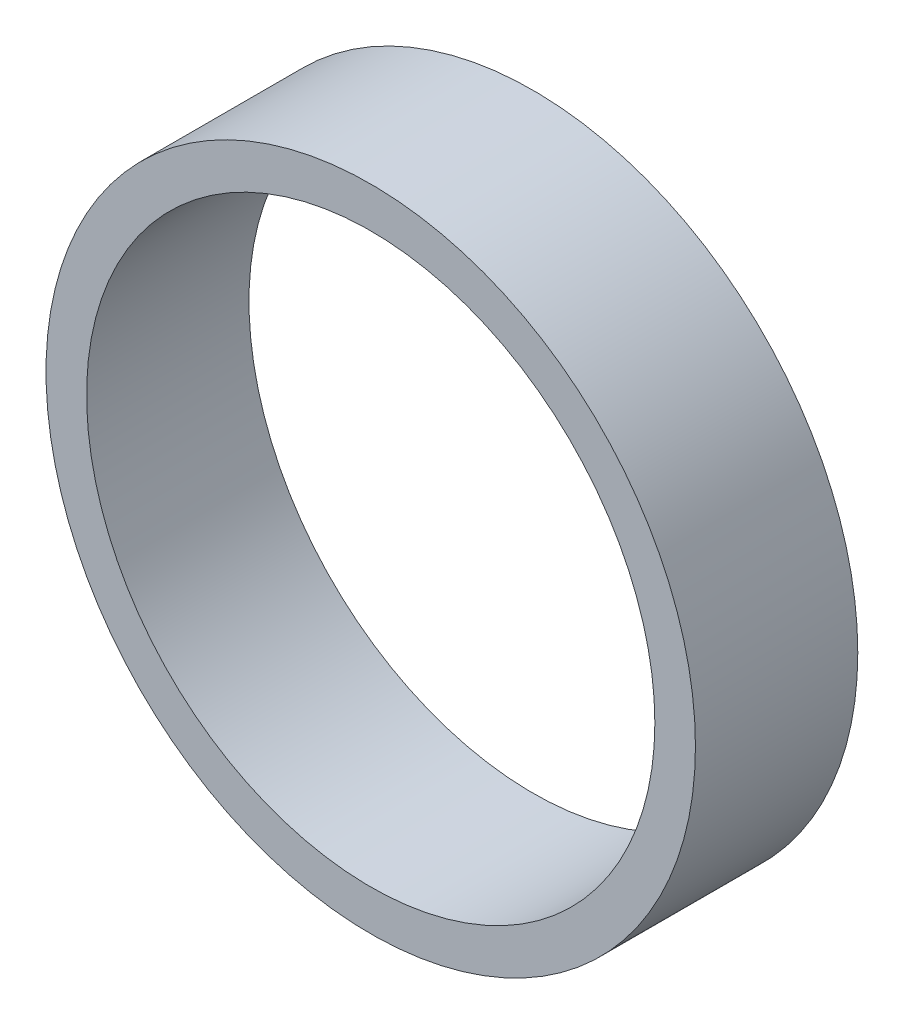
ISO-10303-21;
HEADER;
FILE_DESCRIPTION(('STEP AP214'),'2;1');
FILE_NAME('part.step','',(''),(''),'','','');
FILE_SCHEMA(('AUTOMOTIVE_DESIGN { 1 0 10303 214 1 1 1 1 }'));
ENDSEC;
DATA;
#1=APPLICATION_CONTEXT('core data for automotive mechanical design processes');
#2=APPLICATION_PROTOCOL_DEFINITION('international standard','automotive_design',2000,#1);
#3=PRODUCT_CONTEXT('',#1,'mechanical');
#4=PRODUCT('Part','Part','',(#3));
#5=PRODUCT_RELATED_PRODUCT_CATEGORY('part','',(#4));
#6=PRODUCT_DEFINITION_FORMATION('','',#4);
#7=PRODUCT_DEFINITION_CONTEXT('part definition',#1,'design');
#8=PRODUCT_DEFINITION('design','',#6,#7);
#9=PRODUCT_DEFINITION_SHAPE('','',#8);
#10=(LENGTH_UNIT() NAMED_UNIT(*) SI_UNIT(.MILLI.,.METRE.));
#11=(NAMED_UNIT(*) PLANE_ANGLE_UNIT() SI_UNIT($,.RADIAN.));
#12=(NAMED_UNIT(*) SI_UNIT($,.STERADIAN.) SOLID_ANGLE_UNIT());
#13=UNCERTAINTY_MEASURE_WITH_UNIT(LENGTH_MEASURE(1.E-05),#10,'distance_accuracy_value','');
#14=(GEOMETRIC_REPRESENTATION_CONTEXT(3) GLOBAL_UNCERTAINTY_ASSIGNED_CONTEXT((#13)) GLOBAL_UNIT_ASSIGNED_CONTEXT((#10,
#11,#12)) REPRESENTATION_CONTEXT('',''));
#15=CARTESIAN_POINT('',(0.,0.,0.));
#16=DIRECTION('',(0.,0.,1.));
#17=DIRECTION('',(1.,0.,0.));
#18=AXIS2_PLACEMENT_3D('',#15,#16,#17);
#19=CARTESIAN_POINT('',(0.,0.,6.));
#20=DIRECTION('',(0.,0.,1.));
#21=DIRECTION('',(1.,0.,0.));
#22=AXIS2_PLACEMENT_3D('',#19,#20,#21);
#23=PLANE('',#22);
#24=CARTESIAN_POINT('',(0.,0.,6.));
#25=DIRECTION('',(0.,0.,1.));
#26=DIRECTION('',(1.,0.,0.));
#27=AXIS2_PLACEMENT_3D('',#24,#25,#26);
#28=CIRCLE('',#27,12.);
#29=CARTESIAN_POINT('',(12.,0.,6.));
#30=VERTEX_POINT('',#29);
#31=EDGE_CURVE('E10',#30,#30,#28,.T.);
#32=ORIENTED_EDGE('',*,*,#31,.T.);
#33=EDGE_LOOP('',(#32));
#34=FACE_BOUND('',#33,.T.);
#35=CARTESIAN_POINT('',(0.,0.,6.));
#36=DIRECTION('',(0.,0.,1.));
#37=DIRECTION('',(1.,0.,0.));
#38=AXIS2_PLACEMENT_3D('',#35,#36,#37);
#39=CIRCLE('',#38,10.5);
#40=CARTESIAN_POINT('',(10.5,0.,6.));
#41=VERTEX_POINT('',#40);
#42=EDGE_CURVE('E43',#41,#41,#39,.T.);
#43=ORIENTED_EDGE('',*,*,#42,.F.);
#44=EDGE_LOOP('',(#43));
#45=FACE_BOUND('',#44,.T.);
#46=ADVANCED_FACE('F32',(#34,#45),#23,.T.);
#47=CARTESIAN_POINT('',(0.,0.,0.));
#48=DIRECTION('',(0.,0.,1.));
#49=DIRECTION('',(1.,0.,0.));
#50=AXIS2_PLACEMENT_3D('',#47,#48,#49);
#51=PLANE('',#50);
#52=CARTESIAN_POINT('',(0.,0.,0.));
#53=DIRECTION('',(0.,0.,1.));
#54=DIRECTION('',(1.,0.,0.));
#55=AXIS2_PLACEMENT_3D('',#52,#53,#54);
#56=CIRCLE('',#55,12.);
#57=CARTESIAN_POINT('',(12.,0.,0.));
#58=VERTEX_POINT('',#57);
#59=EDGE_CURVE('E36',#58,#58,#56,.T.);
#60=ORIENTED_EDGE('',*,*,#59,.F.);
#61=EDGE_LOOP('',(#60));
#62=FACE_BOUND('',#61,.T.);
#63=CARTESIAN_POINT('',(0.,0.,0.));
#64=DIRECTION('',(0.,0.,1.));
#65=DIRECTION('',(1.,0.,0.));
#66=AXIS2_PLACEMENT_3D('',#63,#64,#65);
#67=CIRCLE('',#66,10.5);
#68=CARTESIAN_POINT('',(10.5,0.,0.));
#69=VERTEX_POINT('',#68);
#70=EDGE_CURVE('E45',#69,#69,#67,.T.);
#71=ORIENTED_EDGE('',*,*,#70,.T.);
#72=EDGE_LOOP('',(#71));
#73=FACE_BOUND('',#72,.T.);
#74=ADVANCED_FACE('F55',(#62,#73),#51,.F.);
#75=CARTESIAN_POINT('',(0.,0.,6.));
#76=DIRECTION('',(0.,0.,-1.));
#77=DIRECTION('',(-1.,0.,0.));
#78=AXIS2_PLACEMENT_3D('',#75,#76,#77);
#79=CYLINDRICAL_SURFACE('',#78,12.);
#80=ORIENTED_EDGE('',*,*,#31,.F.);
#81=EDGE_LOOP('',(#80));
#82=FACE_BOUND('',#81,.T.);
#83=ORIENTED_EDGE('',*,*,#59,.T.);
#84=EDGE_LOOP('',(#83));
#85=FACE_BOUND('',#84,.T.);
#86=ADVANCED_FACE('F34',(#82,#85),#79,.T.);
#87=CARTESIAN_POINT('',(0.,0.,6.));
#88=DIRECTION('',(0.,0.,-1.));
#89=DIRECTION('',(-1.,0.,0.));
#90=AXIS2_PLACEMENT_3D('',#87,#88,#89);
#91=CYLINDRICAL_SURFACE('',#90,10.5);
#92=ORIENTED_EDGE('',*,*,#42,.T.);
#93=EDGE_LOOP('',(#92));
#94=FACE_BOUND('',#93,.T.);
#95=ORIENTED_EDGE('',*,*,#70,.F.);
#96=EDGE_LOOP('',(#95));
#97=FACE_BOUND('',#96,.T.);
#98=ADVANCED_FACE('F51',(#94,#97),#91,.F.);
#99=CLOSED_SHELL('',(#46,#74,#86,#98));
#100=MANIFOLD_SOLID_BREP('B2',#99);
#101=ADVANCED_BREP_SHAPE_REPRESENTATION('',(#18,#100),#14);
#102=SHAPE_DEFINITION_REPRESENTATION(#9,#101);
ENDSEC;
END-ISO-10303-21;
